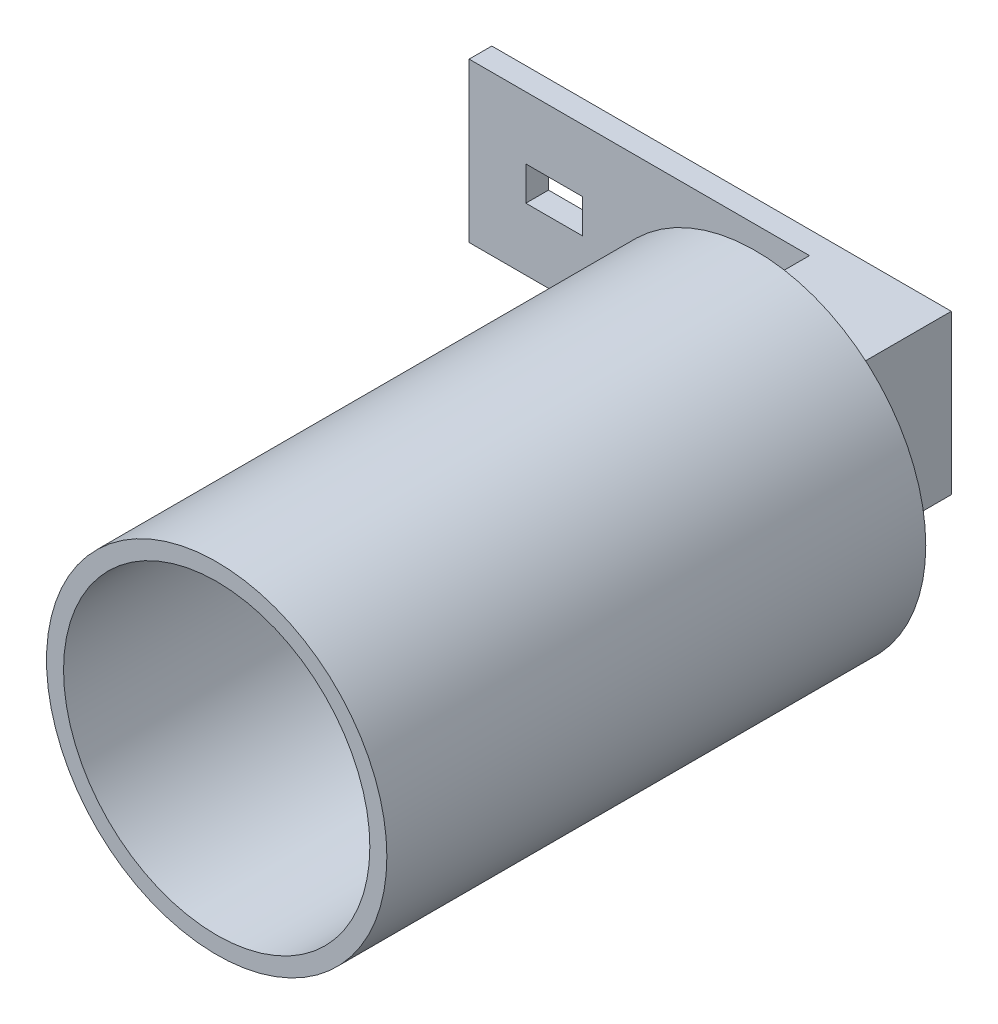
ISO-10303-21;
HEADER;
FILE_DESCRIPTION(('STEP AP214'),'2;1');
FILE_NAME('part.step','',(''),(''),'','','');
FILE_SCHEMA(('AUTOMOTIVE_DESIGN { 1 0 10303 214 1 1 1 1 }'));
ENDSEC;
DATA;
#1=APPLICATION_CONTEXT('core data for automotive mechanical design processes');
#2=APPLICATION_PROTOCOL_DEFINITION('international standard','automotive_design',2000,#1);
#3=PRODUCT_CONTEXT('',#1,'mechanical');
#4=PRODUCT('Part','Part','',(#3));
#5=PRODUCT_RELATED_PRODUCT_CATEGORY('part','',(#4));
#6=PRODUCT_DEFINITION_FORMATION('','',#4);
#7=PRODUCT_DEFINITION_CONTEXT('part definition',#1,'design');
#8=PRODUCT_DEFINITION('design','',#6,#7);
#9=PRODUCT_DEFINITION_SHAPE('','',#8);
#10=(LENGTH_UNIT() NAMED_UNIT(*) SI_UNIT(.MILLI.,.METRE.));
#11=(NAMED_UNIT(*) PLANE_ANGLE_UNIT() SI_UNIT($,.RADIAN.));
#12=(NAMED_UNIT(*) SI_UNIT($,.STERADIAN.) SOLID_ANGLE_UNIT());
#13=UNCERTAINTY_MEASURE_WITH_UNIT(LENGTH_MEASURE(1.E-05),#10,'distance_accuracy_value','');
#14=(GEOMETRIC_REPRESENTATION_CONTEXT(3) GLOBAL_UNCERTAINTY_ASSIGNED_CONTEXT((#13)) GLOBAL_UNIT_ASSIGNED_CONTEXT((#10,
#11,#12)) REPRESENTATION_CONTEXT('',''));
#15=CARTESIAN_POINT('',(0.,0.,0.));
#16=DIRECTION('',(0.,0.,1.));
#17=DIRECTION('',(1.,0.,0.));
#18=AXIS2_PLACEMENT_3D('',#15,#16,#17);
#19=CARTESIAN_POINT('',(-10.5,-14.,-24.));
#20=DIRECTION('',(1.,0.,0.));
#21=DIRECTION('',(0.,0.,-1.));
#22=AXIS2_PLACEMENT_3D('',#19,#20,#21);
#23=PLANE('',#22);
#24=DIRECTION('',(0.,1.,0.));
#25=VECTOR('',#24,1.);
#26=CARTESIAN_POINT('',(-10.5,14.,-20.));
#27=LINE('',#26,#25);
#28=CARTESIAN_POINT('',(-10.5,-14.,-20.));
#29=VERTEX_POINT('',#28);
#30=CARTESIAN_POINT('',(-10.5,14.,-20.));
#31=VERTEX_POINT('',#30);
#32=EDGE_CURVE('E124',#29,#31,#27,.T.);
#33=ORIENTED_EDGE('',*,*,#32,.F.);
#34=DIRECTION('',(0.,0.,1.));
#35=VECTOR('',#34,1.);
#36=CARTESIAN_POINT('',(-10.5,-14.,-24.));
#37=LINE('',#36,#35);
#38=CARTESIAN_POINT('',(-10.5,-14.,0.));
#39=VERTEX_POINT('',#38);
#40=EDGE_CURVE('E172',#29,#39,#37,.T.);
#41=ORIENTED_EDGE('',*,*,#40,.T.);
#42=DIRECTION('',(0.,1.,0.));
#43=VECTOR('',#42,1.);
#44=CARTESIAN_POINT('',(-10.5,-14.,0.));
#45=LINE('',#44,#43);
#46=CARTESIAN_POINT('',(-10.5,14.,0.));
#47=VERTEX_POINT('',#46);
#48=EDGE_CURVE('E164',#39,#47,#45,.T.);
#49=ORIENTED_EDGE('',*,*,#48,.T.);
#50=DIRECTION('',(0.,0.,1.));
#51=VECTOR('',#50,1.);
#52=CARTESIAN_POINT('',(-10.5,14.,-24.));
#53=LINE('',#52,#51);
#54=EDGE_CURVE('E190',#31,#47,#53,.T.);
#55=ORIENTED_EDGE('',*,*,#54,.F.);
#56=EDGE_LOOP('',(#33,#41,#49,#55));
#57=FACE_BOUND('',#56,.T.);
#58=ADVANCED_FACE('F33',(#57),#23,.F.);
#59=CARTESIAN_POINT('',(0.,0.,0.));
#60=DIRECTION('',(0.,0.,1.));
#61=DIRECTION('',(1.,0.,0.));
#62=AXIS2_PLACEMENT_3D('',#59,#60,#61);
#63=PLANE('',#62);
#64=CARTESIAN_POINT('',(0.,0.,0.));
#65=DIRECTION('',(0.,0.,1.));
#66=DIRECTION('',(1.,0.,0.));
#67=AXIS2_PLACEMENT_3D('',#64,#65,#66);
#68=CIRCLE('',#67,30.);
#69=CARTESIAN_POINT('',(30.,0.,0.));
#70=VERTEX_POINT('',#69);
#71=EDGE_CURVE('E37',#70,#70,#68,.T.);
#72=ORIENTED_EDGE('',*,*,#71,.F.);
#73=EDGE_LOOP('',(#72));
#74=FACE_BOUND('',#73,.T.);
#75=ORIENTED_EDGE('',*,*,#48,.F.);
#76=DIRECTION('',(-1.,0.,0.));
#77=VECTOR('',#76,1.);
#78=CARTESIAN_POINT('',(10.5,-14.,0.));
#79=LINE('',#78,#77);
#80=CARTESIAN_POINT('',(10.5,-14.,0.));
#81=VERTEX_POINT('',#80);
#82=EDGE_CURVE('E168',#81,#39,#79,.T.);
#83=ORIENTED_EDGE('',*,*,#82,.F.);
#84=DIRECTION('',(0.,-1.,0.));
#85=VECTOR('',#84,1.);
#86=CARTESIAN_POINT('',(10.5,-14.,0.));
#87=LINE('',#86,#85);
#88=CARTESIAN_POINT('',(10.5,14.,0.));
#89=VERTEX_POINT('',#88);
#90=EDGE_CURVE('E178',#89,#81,#87,.T.);
#91=ORIENTED_EDGE('',*,*,#90,.F.);
#92=DIRECTION('',(1.,0.,0.));
#93=VECTOR('',#92,1.);
#94=CARTESIAN_POINT('',(10.5,14.,0.));
#95=LINE('',#94,#93);
#96=EDGE_CURVE('E175',#47,#89,#95,.T.);
#97=ORIENTED_EDGE('',*,*,#96,.F.);
#98=EDGE_LOOP('',(#75,#83,#91,#97));
#99=FACE_BOUND('',#98,.T.);
#100=ADVANCED_FACE('F209',(#74,#99),#63,.F.);
#101=CARTESIAN_POINT('',(0.,0.,95.));
#102=DIRECTION('',(0.,0.,-1.));
#103=DIRECTION('',(-1.,0.,0.));
#104=AXIS2_PLACEMENT_3D('',#101,#102,#103);
#105=CYLINDRICAL_SURFACE('',#104,30.);
#106=CARTESIAN_POINT('',(0.,0.,95.));
#107=DIRECTION('',(0.,0.,1.));
#108=DIRECTION('',(1.,0.,0.));
#109=AXIS2_PLACEMENT_3D('',#106,#107,#108);
#110=CIRCLE('',#109,30.);
#111=CARTESIAN_POINT('',(30.,0.,95.));
#112=VERTEX_POINT('',#111);
#113=EDGE_CURVE('E11',#112,#112,#110,.T.);
#114=ORIENTED_EDGE('',*,*,#113,.F.);
#115=EDGE_LOOP('',(#114));
#116=FACE_BOUND('',#115,.T.);
#117=ORIENTED_EDGE('',*,*,#71,.T.);
#118=EDGE_LOOP('',(#117));
#119=FACE_BOUND('',#118,.T.);
#120=ADVANCED_FACE('F35',(#116,#119),#105,.T.);
#121=CARTESIAN_POINT('',(0.,0.,95.));
#122=DIRECTION('',(0.,0.,1.));
#123=DIRECTION('',(1.,0.,0.));
#124=AXIS2_PLACEMENT_3D('',#121,#122,#123);
#125=PLANE('',#124);
#126=CARTESIAN_POINT('',(0.,0.,95.));
#127=DIRECTION('',(0.,0.,1.));
#128=DIRECTION('',(1.,0.,0.));
#129=AXIS2_PLACEMENT_3D('',#126,#127,#128);
#130=CIRCLE('',#129,27.);
#131=CARTESIAN_POINT('',(27.,0.,95.));
#132=VERTEX_POINT('',#131);
#133=EDGE_CURVE('E192',#132,#132,#130,.T.);
#134=ORIENTED_EDGE('',*,*,#133,.F.);
#135=EDGE_LOOP('',(#134));
#136=FACE_BOUND('',#135,.T.);
#137=ORIENTED_EDGE('',*,*,#113,.T.);
#138=EDGE_LOOP('',(#137));
#139=FACE_BOUND('',#138,.T.);
#140=ADVANCED_FACE('F201',(#136,#139),#125,.T.);
#141=CARTESIAN_POINT('',(0.,0.,15.));
#142=DIRECTION('',(0.,0.,1.));
#143=DIRECTION('',(1.,0.,0.));
#144=AXIS2_PLACEMENT_3D('',#141,#142,#143);
#145=CYLINDRICAL_SURFACE('',#144,27.);
#146=CARTESIAN_POINT('',(0.,0.,15.));
#147=DIRECTION('',(0.,0.,1.));
#148=DIRECTION('',(1.,0.,0.));
#149=AXIS2_PLACEMENT_3D('',#146,#147,#148);
#150=CIRCLE('',#149,27.);
#151=CARTESIAN_POINT('',(27.,0.,15.));
#152=VERTEX_POINT('',#151);
#153=EDGE_CURVE('E193',#152,#152,#150,.T.);
#154=ORIENTED_EDGE('',*,*,#153,.F.);
#155=EDGE_LOOP('',(#154));
#156=FACE_BOUND('',#155,.T.);
#157=ORIENTED_EDGE('',*,*,#133,.T.);
#158=EDGE_LOOP('',(#157));
#159=FACE_BOUND('',#158,.T.);
#160=ADVANCED_FACE('F199',(#156,#159),#145,.F.);
#161=CARTESIAN_POINT('',(0.,0.,15.));
#162=DIRECTION('',(0.,0.,1.));
#163=DIRECTION('',(1.,0.,0.));
#164=AXIS2_PLACEMENT_3D('',#161,#162,#163);
#165=PLANE('',#164);
#166=ORIENTED_EDGE('',*,*,#153,.T.);
#167=EDGE_LOOP('',(#166));
#168=FACE_BOUND('',#167,.T.);
#169=ADVANCED_FACE('F256',(#168),#165,.T.);
#170=CARTESIAN_POINT('',(10.5,14.,-24.));
#171=DIRECTION('',(0.,-1.,0.));
#172=DIRECTION('',(0.,0.,-1.));
#173=AXIS2_PLACEMENT_3D('',#170,#171,#172);
#174=PLANE('',#173);
#175=ORIENTED_EDGE('',*,*,#96,.T.);
#176=DIRECTION('',(0.,0.,1.));
#177=VECTOR('',#176,1.);
#178=CARTESIAN_POINT('',(10.5,14.,-24.));
#179=LINE('',#178,#177);
#180=CARTESIAN_POINT('',(10.5,14.,-24.));
#181=VERTEX_POINT('',#180);
#182=EDGE_CURVE('E187',#181,#89,#179,.T.);
#183=ORIENTED_EDGE('',*,*,#182,.F.);
#184=DIRECTION('',(1.,0.,0.));
#185=VECTOR('',#184,1.);
#186=CARTESIAN_POINT('',(10.5,14.,-24.));
#187=LINE('',#186,#185);
#188=CARTESIAN_POINT('',(-70.5,14.,-24.));
#189=VERTEX_POINT('',#188);
#190=EDGE_CURVE('E165',#189,#181,#187,.T.);
#191=ORIENTED_EDGE('',*,*,#190,.F.);
#192=DIRECTION('',(0.,0.,-1.));
#193=VECTOR('',#192,1.);
#194=CARTESIAN_POINT('',(-70.5,14.,-24.));
#195=LINE('',#194,#193);
#196=CARTESIAN_POINT('',(-70.5,14.,-20.));
#197=VERTEX_POINT('',#196);
#198=EDGE_CURVE('E150',#197,#189,#195,.T.);
#199=ORIENTED_EDGE('',*,*,#198,.F.);
#200=DIRECTION('',(1.,0.,0.));
#201=VECTOR('',#200,1.);
#202=CARTESIAN_POINT('',(-70.5,14.,-20.));
#203=LINE('',#202,#201);
#204=EDGE_CURVE('E162',#197,#31,#203,.T.);
#205=ORIENTED_EDGE('',*,*,#204,.T.);
#206=ORIENTED_EDGE('',*,*,#54,.T.);
#207=EDGE_LOOP('',(#175,#183,#191,#199,#205,#206));
#208=FACE_BOUND('',#207,.T.);
#209=ADVANCED_FACE('F231',(#208),#174,.F.);
#210=CARTESIAN_POINT('',(10.5,-14.,-24.));
#211=DIRECTION('',(-1.,0.,0.));
#212=DIRECTION('',(0.,0.,1.));
#213=AXIS2_PLACEMENT_3D('',#210,#211,#212);
#214=PLANE('',#213);
#215=ORIENTED_EDGE('',*,*,#90,.T.);
#216=DIRECTION('',(0.,0.,1.));
#217=VECTOR('',#216,1.);
#218=CARTESIAN_POINT('',(10.5,-14.,-24.));
#219=LINE('',#218,#217);
#220=CARTESIAN_POINT('',(10.5,-14.,-24.));
#221=VERTEX_POINT('',#220);
#222=EDGE_CURVE('E184',#221,#81,#219,.T.);
#223=ORIENTED_EDGE('',*,*,#222,.F.);
#224=DIRECTION('',(0.,-1.,0.));
#225=VECTOR('',#224,1.);
#226=CARTESIAN_POINT('',(10.5,-14.,-24.));
#227=LINE('',#226,#225);
#228=EDGE_CURVE('E167',#181,#221,#227,.T.);
#229=ORIENTED_EDGE('',*,*,#228,.F.);
#230=ORIENTED_EDGE('',*,*,#182,.T.);
#231=EDGE_LOOP('',(#215,#223,#229,#230));
#232=FACE_BOUND('',#231,.T.);
#233=ADVANCED_FACE('F228',(#232),#214,.F.);
#234=CARTESIAN_POINT('',(10.5,-14.,-24.));
#235=DIRECTION('',(0.,1.,0.));
#236=DIRECTION('',(0.,0.,1.));
#237=AXIS2_PLACEMENT_3D('',#234,#235,#236);
#238=PLANE('',#237);
#239=ORIENTED_EDGE('',*,*,#82,.T.);
#240=ORIENTED_EDGE('',*,*,#40,.F.);
#241=DIRECTION('',(1.,0.,0.));
#242=VECTOR('',#241,1.);
#243=CARTESIAN_POINT('',(-70.5,-14.,-20.));
#244=LINE('',#243,#242);
#245=CARTESIAN_POINT('',(-70.5,-14.,-20.));
#246=VERTEX_POINT('',#245);
#247=EDGE_CURVE('E158',#246,#29,#244,.T.);
#248=ORIENTED_EDGE('',*,*,#247,.F.);
#249=DIRECTION('',(0.,0.,1.));
#250=VECTOR('',#249,1.);
#251=CARTESIAN_POINT('',(-70.5,-14.,-24.));
#252=LINE('',#251,#250);
#253=CARTESIAN_POINT('',(-70.5,-14.,-24.));
#254=VERTEX_POINT('',#253);
#255=EDGE_CURVE('E156',#254,#246,#252,.T.);
#256=ORIENTED_EDGE('',*,*,#255,.F.);
#257=DIRECTION('',(-1.,0.,0.));
#258=VECTOR('',#257,1.);
#259=CARTESIAN_POINT('',(10.5,-14.,-24.));
#260=LINE('',#259,#258);
#261=EDGE_CURVE('E170',#221,#254,#260,.T.);
#262=ORIENTED_EDGE('',*,*,#261,.F.);
#263=ORIENTED_EDGE('',*,*,#222,.T.);
#264=EDGE_LOOP('',(#239,#240,#248,#256,#262,#263));
#265=FACE_BOUND('',#264,.T.);
#266=ADVANCED_FACE('F221',(#265),#238,.F.);
#267=CARTESIAN_POINT('',(0.,0.,-24.));
#268=DIRECTION('',(0.,0.,1.));
#269=DIRECTION('',(1.,0.,0.));
#270=AXIS2_PLACEMENT_3D('',#267,#268,#269);
#271=PLANE('',#270);
#272=DIRECTION('',(1.,0.,0.));
#273=VECTOR('',#272,1.);
#274=CARTESIAN_POINT('',(-50.5,3.,-24.));
#275=LINE('',#274,#273);
#276=CARTESIAN_POINT('',(-60.5,3.,-24.));
#277=VERTEX_POINT('',#276);
#278=CARTESIAN_POINT('',(-50.5,3.,-24.));
#279=VERTEX_POINT('',#278);
#280=EDGE_CURVE('E132',#277,#279,#275,.T.);
#281=ORIENTED_EDGE('',*,*,#280,.F.);
#282=DIRECTION('',(0.,1.,0.));
#283=VECTOR('',#282,1.);
#284=CARTESIAN_POINT('',(-60.5,-3.,-24.));
#285=LINE('',#284,#283);
#286=CARTESIAN_POINT('',(-60.5,-3.,-24.));
#287=VERTEX_POINT('',#286);
#288=EDGE_CURVE('E48',#287,#277,#285,.T.);
#289=ORIENTED_EDGE('',*,*,#288,.F.);
#290=DIRECTION('',(-1.,0.,0.));
#291=VECTOR('',#290,1.);
#292=CARTESIAN_POINT('',(-50.5,-3.,-24.));
#293=LINE('',#292,#291);
#294=CARTESIAN_POINT('',(-50.5,-3.,-24.));
#295=VERTEX_POINT('',#294);
#296=EDGE_CURVE('E118',#295,#287,#293,.T.);
#297=ORIENTED_EDGE('',*,*,#296,.F.);
#298=DIRECTION('',(0.,-1.,0.));
#299=VECTOR('',#298,1.);
#300=CARTESIAN_POINT('',(-50.5,-3.,-24.));
#301=LINE('',#300,#299);
#302=EDGE_CURVE('E138',#279,#295,#301,.T.);
#303=ORIENTED_EDGE('',*,*,#302,.F.);
#304=EDGE_LOOP('',(#281,#289,#297,#303));
#305=FACE_BOUND('',#304,.T.);
#306=ORIENTED_EDGE('',*,*,#261,.T.);
#307=DIRECTION('',(0.,-1.,0.));
#308=VECTOR('',#307,1.);
#309=CARTESIAN_POINT('',(-70.5,14.,-24.));
#310=LINE('',#309,#308);
#311=EDGE_CURVE('E153',#189,#254,#310,.T.);
#312=ORIENTED_EDGE('',*,*,#311,.F.);
#313=ORIENTED_EDGE('',*,*,#190,.T.);
#314=ORIENTED_EDGE('',*,*,#228,.T.);
#315=EDGE_LOOP('',(#306,#312,#313,#314));
#316=FACE_BOUND('',#315,.T.);
#317=ADVANCED_FACE('F239',(#305,#316),#271,.F.);
#318=CARTESIAN_POINT('',(-70.5,14.,-20.));
#319=DIRECTION('',(0.,0.,-1.));
#320=DIRECTION('',(0.,1.,0.));
#321=AXIS2_PLACEMENT_3D('',#318,#319,#320);
#322=PLANE('',#321);
#323=DIRECTION('',(1.,0.,0.));
#324=VECTOR('',#323,1.);
#325=CARTESIAN_POINT('',(-50.5,-3.,-20.));
#326=LINE('',#325,#324);
#327=CARTESIAN_POINT('',(-60.5,-3.,-20.));
#328=VERTEX_POINT('',#327);
#329=CARTESIAN_POINT('',(-50.5,-3.,-20.));
#330=VERTEX_POINT('',#329);
#331=EDGE_CURVE('E130',#328,#330,#326,.T.);
#332=ORIENTED_EDGE('',*,*,#331,.F.);
#333=DIRECTION('',(0.,-1.,0.));
#334=VECTOR('',#333,1.);
#335=CARTESIAN_POINT('',(-60.5,-3.00000000000002,-20.));
#336=LINE('',#335,#334);
#337=CARTESIAN_POINT('',(-60.5,3.,-20.));
#338=VERTEX_POINT('',#337);
#339=EDGE_CURVE('E112',#338,#328,#336,.T.);
#340=ORIENTED_EDGE('',*,*,#339,.F.);
#341=DIRECTION('',(-1.,0.,0.));
#342=VECTOR('',#341,1.);
#343=CARTESIAN_POINT('',(-50.5,3.,-20.));
#344=LINE('',#343,#342);
#345=CARTESIAN_POINT('',(-50.5,3.,-20.));
#346=VERTEX_POINT('',#345);
#347=EDGE_CURVE('E121',#346,#338,#344,.T.);
#348=ORIENTED_EDGE('',*,*,#347,.F.);
#349=DIRECTION('',(0.,1.,0.));
#350=VECTOR('',#349,1.);
#351=CARTESIAN_POINT('',(-50.5,-3.00000000000002,-20.));
#352=LINE('',#351,#350);
#353=EDGE_CURVE('E56',#330,#346,#352,.T.);
#354=ORIENTED_EDGE('',*,*,#353,.F.);
#355=EDGE_LOOP('',(#332,#340,#348,#354));
#356=FACE_BOUND('',#355,.T.);
#357=ORIENTED_EDGE('',*,*,#32,.T.);
#358=ORIENTED_EDGE('',*,*,#204,.F.);
#359=DIRECTION('',(0.,1.,0.));
#360=VECTOR('',#359,1.);
#361=CARTESIAN_POINT('',(-70.5,14.,-20.));
#362=LINE('',#361,#360);
#363=EDGE_CURVE('E147',#246,#197,#362,.T.);
#364=ORIENTED_EDGE('',*,*,#363,.F.);
#365=ORIENTED_EDGE('',*,*,#247,.T.);
#366=EDGE_LOOP('',(#357,#358,#364,#365));
#367=FACE_BOUND('',#366,.T.);
#368=ADVANCED_FACE('F127',(#356,#367),#322,.F.);
#369=CARTESIAN_POINT('',(-70.5,0.,0.));
#370=DIRECTION('',(-1.,0.,0.));
#371=DIRECTION('',(0.,0.,1.));
#372=AXIS2_PLACEMENT_3D('',#369,#370,#371);
#373=PLANE('',#372);
#374=ORIENTED_EDGE('',*,*,#363,.T.);
#375=ORIENTED_EDGE('',*,*,#198,.T.);
#376=ORIENTED_EDGE('',*,*,#311,.T.);
#377=ORIENTED_EDGE('',*,*,#255,.T.);
#378=EDGE_LOOP('',(#374,#375,#376,#377));
#379=FACE_BOUND('',#378,.T.);
#380=ADVANCED_FACE('F236',(#379),#373,.T.);
#381=CARTESIAN_POINT('',(-60.5,-3.,95.001));
#382=DIRECTION('',(-1.,0.,0.));
#383=DIRECTION('',(0.,0.,1.));
#384=AXIS2_PLACEMENT_3D('',#381,#382,#383);
#385=PLANE('',#384);
#386=ORIENTED_EDGE('',*,*,#339,.T.);
#387=DIRECTION('',(0.,0.,-1.));
#388=VECTOR('',#387,1.);
#389=CARTESIAN_POINT('',(-60.5,-3.,95.001));
#390=LINE('',#389,#388);
#391=EDGE_CURVE('E125',#328,#287,#390,.T.);
#392=ORIENTED_EDGE('',*,*,#391,.T.);
#393=ORIENTED_EDGE('',*,*,#288,.T.);
#394=DIRECTION('',(0.,0.,-1.));
#395=VECTOR('',#394,1.);
#396=CARTESIAN_POINT('',(-60.5,3.,95.001));
#397=LINE('',#396,#395);
#398=EDGE_CURVE('E108',#338,#277,#397,.T.);
#399=ORIENTED_EDGE('',*,*,#398,.F.);
#400=EDGE_LOOP('',(#386,#392,#393,#399));
#401=FACE_BOUND('',#400,.T.);
#402=ADVANCED_FACE('F110',(#401),#385,.F.);
#403=CARTESIAN_POINT('',(-50.5,-3.,95.001));
#404=DIRECTION('',(0.,-1.,0.));
#405=DIRECTION('',(0.,0.,-1.));
#406=AXIS2_PLACEMENT_3D('',#403,#404,#405);
#407=PLANE('',#406);
#408=ORIENTED_EDGE('',*,*,#331,.T.);
#409=DIRECTION('',(0.,0.,-1.));
#410=VECTOR('',#409,1.);
#411=CARTESIAN_POINT('',(-50.5,-3.,95.001));
#412=LINE('',#411,#410);
#413=EDGE_CURVE('E144',#330,#295,#412,.T.);
#414=ORIENTED_EDGE('',*,*,#413,.T.);
#415=ORIENTED_EDGE('',*,*,#296,.T.);
#416=ORIENTED_EDGE('',*,*,#391,.F.);
#417=EDGE_LOOP('',(#408,#414,#415,#416));
#418=FACE_BOUND('',#417,.T.);
#419=ADVANCED_FACE('F315',(#418),#407,.F.);
#420=CARTESIAN_POINT('',(-50.5,-3.,95.001));
#421=DIRECTION('',(1.,0.,0.));
#422=DIRECTION('',(0.,0.,-1.));
#423=AXIS2_PLACEMENT_3D('',#420,#421,#422);
#424=PLANE('',#423);
#425=ORIENTED_EDGE('',*,*,#353,.T.);
#426=DIRECTION('',(0.,0.,-1.));
#427=VECTOR('',#426,1.);
#428=CARTESIAN_POINT('',(-50.5,3.,95.001));
#429=LINE('',#428,#427);
#430=EDGE_CURVE('E117',#346,#279,#429,.T.);
#431=ORIENTED_EDGE('',*,*,#430,.T.);
#432=ORIENTED_EDGE('',*,*,#302,.T.);
#433=ORIENTED_EDGE('',*,*,#413,.F.);
#434=EDGE_LOOP('',(#425,#431,#432,#433));
#435=FACE_BOUND('',#434,.T.);
#436=ADVANCED_FACE('F324',(#435),#424,.F.);
#437=CARTESIAN_POINT('',(-50.5,3.,95.001));
#438=DIRECTION('',(0.,1.,0.));
#439=DIRECTION('',(0.,0.,1.));
#440=AXIS2_PLACEMENT_3D('',#437,#438,#439);
#441=PLANE('',#440);
#442=ORIENTED_EDGE('',*,*,#347,.T.);
#443=ORIENTED_EDGE('',*,*,#398,.T.);
#444=ORIENTED_EDGE('',*,*,#280,.T.);
#445=ORIENTED_EDGE('',*,*,#430,.F.);
#446=EDGE_LOOP('',(#442,#443,#444,#445));
#447=FACE_BOUND('',#446,.T.);
#448=ADVANCED_FACE('F122',(#447),#441,.F.);
#449=CLOSED_SHELL('',(#58,#100,#120,#140,#160,#169,#209,#233,#266,#317,#368,#380,#402,#419,#436,#448));
#450=MANIFOLD_SOLID_BREP('B2',#449);
#451=ADVANCED_BREP_SHAPE_REPRESENTATION('',(#18,#450),#14);
#452=SHAPE_DEFINITION_REPRESENTATION(#9,#451);
ENDSEC;
END-ISO-10303-21;
